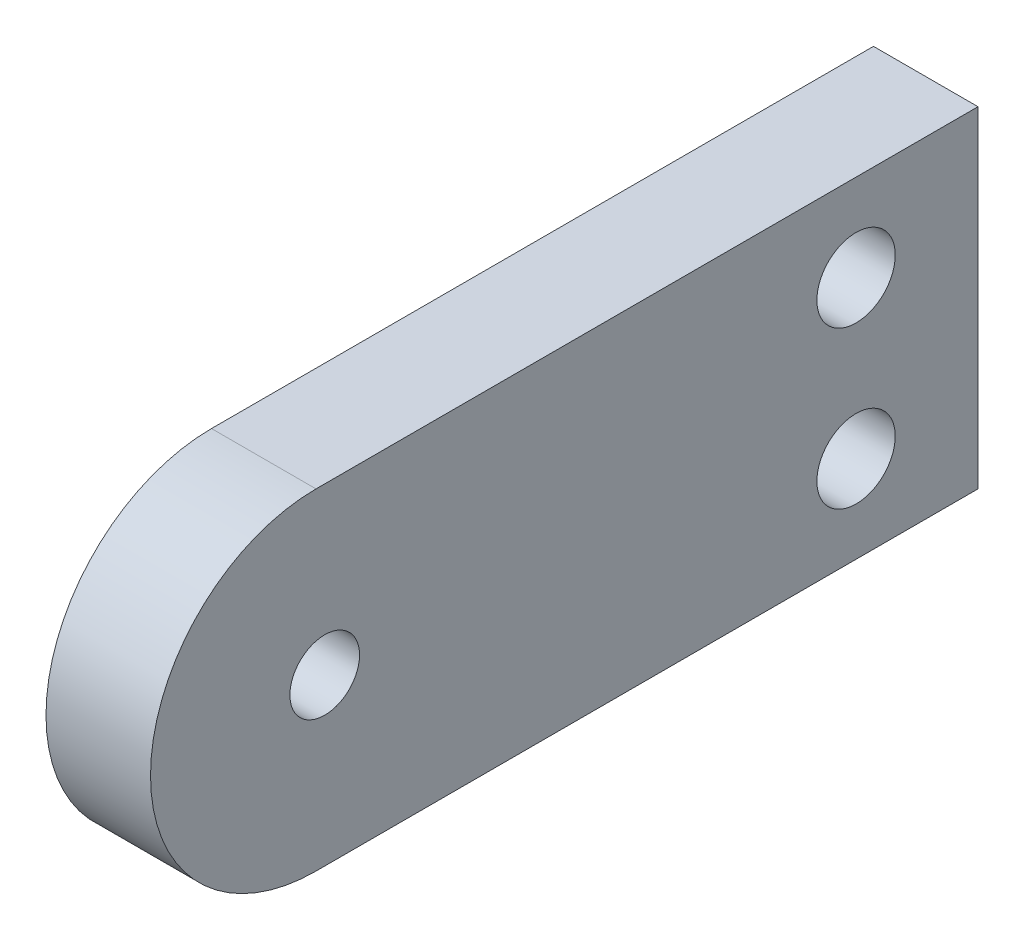
ISO-10303-21;
HEADER;
FILE_DESCRIPTION(('STEP AP214'),'2;1');
FILE_NAME('part.step','',(''),(''),'','','');
FILE_SCHEMA(('AUTOMOTIVE_DESIGN { 1 0 10303 214 1 1 1 1 }'));
ENDSEC;
DATA;
#1=APPLICATION_CONTEXT('core data for automotive mechanical design processes');
#2=APPLICATION_PROTOCOL_DEFINITION('international standard','automotive_design',2000,#1);
#3=PRODUCT_CONTEXT('',#1,'mechanical');
#4=PRODUCT('Part','Part','',(#3));
#5=PRODUCT_RELATED_PRODUCT_CATEGORY('part','',(#4));
#6=PRODUCT_DEFINITION_FORMATION('','',#4);
#7=PRODUCT_DEFINITION_CONTEXT('part definition',#1,'design');
#8=PRODUCT_DEFINITION('design','',#6,#7);
#9=PRODUCT_DEFINITION_SHAPE('','',#8);
#10=(LENGTH_UNIT() NAMED_UNIT(*) SI_UNIT(.MILLI.,.METRE.));
#11=(NAMED_UNIT(*) PLANE_ANGLE_UNIT() SI_UNIT($,.RADIAN.));
#12=(NAMED_UNIT(*) SI_UNIT($,.STERADIAN.) SOLID_ANGLE_UNIT());
#13=UNCERTAINTY_MEASURE_WITH_UNIT(LENGTH_MEASURE(1.E-05),#10,'distance_accuracy_value','');
#14=(GEOMETRIC_REPRESENTATION_CONTEXT(3) GLOBAL_UNCERTAINTY_ASSIGNED_CONTEXT((#13)) GLOBAL_UNIT_ASSIGNED_CONTEXT((#10,
#11,#12)) REPRESENTATION_CONTEXT('',''));
#15=CARTESIAN_POINT('',(0.,0.,0.));
#16=DIRECTION('',(0.,0.,1.));
#17=DIRECTION('',(1.,0.,0.));
#18=AXIS2_PLACEMENT_3D('',#15,#16,#17);
#19=CARTESIAN_POINT('',(22.,-4.5,119.5));
#20=DIRECTION('',(1.,0.,0.));
#21=DIRECTION('',(0.,0.,-1.));
#22=AXIS2_PLACEMENT_3D('',#19,#20,#21);
#23=CYLINDRICAL_SURFACE('',#22,1.5);
#24=CARTESIAN_POINT('',(22.,-4.5,119.5));
#25=DIRECTION('',(1.,0.,0.));
#26=DIRECTION('',(0.,0.,-1.));
#27=AXIS2_PLACEMENT_3D('',#24,#25,#26);
#28=CIRCLE('',#27,1.5);
#29=CARTESIAN_POINT('',(22.,-4.5,118.));
#30=VERTEX_POINT('',#29);
#31=EDGE_CURVE('E322',#30,#30,#28,.T.);
#32=ORIENTED_EDGE('',*,*,#31,.F.);
#33=EDGE_LOOP('',(#32));
#34=FACE_BOUND('',#33,.T.);
#35=CARTESIAN_POINT('',(24.,-4.5,119.5));
#36=DIRECTION('',(1.,0.,0.));
#37=DIRECTION('',(0.,1.,0.));
#38=AXIS2_PLACEMENT_3D('',#35,#36,#37);
#39=CIRCLE('',#38,1.5);
#40=CARTESIAN_POINT('',(24.,-3.,119.5));
#41=VERTEX_POINT('',#40);
#42=EDGE_CURVE('E239',#41,#41,#39,.F.);
#43=ORIENTED_EDGE('',*,*,#42,.F.);
#44=EDGE_LOOP('',(#43));
#45=FACE_BOUND('',#44,.T.);
#46=ADVANCED_FACE('F235',(#34,#45),#23,.F.);
#47=CARTESIAN_POINT('',(22.,4.5,119.5));
#48=DIRECTION('',(1.,0.,0.));
#49=DIRECTION('',(0.,0.,-1.));
#50=AXIS2_PLACEMENT_3D('',#47,#48,#49);
#51=CYLINDRICAL_SURFACE('',#50,1.5);
#52=CARTESIAN_POINT('',(22.,4.5,119.5));
#53=DIRECTION('',(1.,0.,0.));
#54=DIRECTION('',(0.,0.,-1.));
#55=AXIS2_PLACEMENT_3D('',#52,#53,#54);
#56=CIRCLE('',#55,1.5);
#57=CARTESIAN_POINT('',(22.,4.5,118.));
#58=VERTEX_POINT('',#57);
#59=EDGE_CURVE('E290',#58,#58,#56,.T.);
#60=ORIENTED_EDGE('',*,*,#59,.F.);
#61=EDGE_LOOP('',(#60));
#62=FACE_BOUND('',#61,.T.);
#63=CARTESIAN_POINT('',(24.,4.5,119.5));
#64=DIRECTION('',(1.,0.,0.));
#65=DIRECTION('',(0.,1.,0.));
#66=AXIS2_PLACEMENT_3D('',#63,#64,#65);
#67=CIRCLE('',#66,1.5);
#68=CARTESIAN_POINT('',(24.,6.,119.5));
#69=VERTEX_POINT('',#68);
#70=EDGE_CURVE('E316',#69,#69,#67,.F.);
#71=ORIENTED_EDGE('',*,*,#70,.F.);
#72=EDGE_LOOP('',(#71));
#73=FACE_BOUND('',#72,.T.);
#74=ADVANCED_FACE('F346',(#62,#73),#51,.F.);
#75=CARTESIAN_POINT('',(28.,0.,0.));
#76=DIRECTION('',(1.,0.,0.));
#77=DIRECTION('',(0.,0.,-1.));
#78=AXIS2_PLACEMENT_3D('',#75,#76,#77);
#79=PLANE('',#78);
#80=CARTESIAN_POINT('',(28.,4.5,119.5));
#81=DIRECTION('',(1.,0.,0.));
#82=DIRECTION('',(0.,0.,-1.));
#83=AXIS2_PLACEMENT_3D('',#80,#81,#82);
#84=CIRCLE('',#83,2.25);
#85=CARTESIAN_POINT('',(28.,4.5,117.25));
#86=VERTEX_POINT('',#85);
#87=EDGE_CURVE('E324',#86,#86,#84,.T.);
#88=ORIENTED_EDGE('',*,*,#87,.F.);
#89=EDGE_LOOP('',(#88));
#90=FACE_BOUND('',#89,.T.);
#91=CARTESIAN_POINT('',(28.,-4.5,119.5));
#92=DIRECTION('',(1.,0.,0.));
#93=DIRECTION('',(0.,0.,-1.));
#94=AXIS2_PLACEMENT_3D('',#91,#92,#93);
#95=CIRCLE('',#94,2.25);
#96=CARTESIAN_POINT('',(28.,-4.5,117.25));
#97=VERTEX_POINT('',#96);
#98=EDGE_CURVE('E329',#97,#97,#95,.T.);
#99=ORIENTED_EDGE('',*,*,#98,.F.);
#100=EDGE_LOOP('',(#99));
#101=FACE_BOUND('',#100,.T.);
#102=DIRECTION('',(0.,-1.,0.));
#103=VECTOR('',#102,1.);
#104=CARTESIAN_POINT('',(28.,9.5,112.5));
#105=LINE('',#104,#103);
#106=CARTESIAN_POINT('',(28.,9.5,112.5));
#107=VERTEX_POINT('',#106);
#108=CARTESIAN_POINT('',(28.,-9.5,112.5));
#109=VERTEX_POINT('',#108);
#110=EDGE_CURVE('E289',#107,#109,#105,.T.);
#111=ORIENTED_EDGE('',*,*,#110,.F.);
#112=DIRECTION('',(0.,0.,-1.));
#113=VECTOR('',#112,1.);
#114=CARTESIAN_POINT('',(28.,9.5,160.));
#115=LINE('',#114,#113);
#116=CARTESIAN_POINT('',(28.,9.5,150.5));
#117=VERTEX_POINT('',#116);
#118=EDGE_CURVE('E306',#117,#107,#115,.T.);
#119=ORIENTED_EDGE('',*,*,#118,.F.);
#120=CARTESIAN_POINT('',(28.,0.,150.5));
#121=DIRECTION('',(1.,0.,0.));
#122=DIRECTION('',(0.,0.,-1.));
#123=AXIS2_PLACEMENT_3D('',#120,#121,#122);
#124=CIRCLE('',#123,9.5);
#125=CARTESIAN_POINT('',(28.,-9.5,150.5));
#126=VERTEX_POINT('',#125);
#127=EDGE_CURVE('E244',#117,#126,#124,.T.);
#128=ORIENTED_EDGE('',*,*,#127,.T.);
#129=DIRECTION('',(0.,0.,-1.));
#130=VECTOR('',#129,1.);
#131=CARTESIAN_POINT('',(28.,-9.5,160.));
#132=LINE('',#131,#130);
#133=EDGE_CURVE('E283',#126,#109,#132,.T.);
#134=ORIENTED_EDGE('',*,*,#133,.T.);
#135=EDGE_LOOP('',(#111,#119,#128,#134));
#136=FACE_BOUND('',#135,.T.);
#137=CARTESIAN_POINT('',(28.,0.,150.));
#138=DIRECTION('',(1.,0.,0.));
#139=DIRECTION('',(0.,0.,-1.));
#140=AXIS2_PLACEMENT_3D('',#137,#138,#139);
#141=CIRCLE('',#140,2.);
#142=CARTESIAN_POINT('',(28.,0.,148.));
#143=VERTEX_POINT('',#142);
#144=EDGE_CURVE('E297',#143,#143,#141,.T.);
#145=ORIENTED_EDGE('',*,*,#144,.F.);
#146=EDGE_LOOP('',(#145));
#147=FACE_BOUND('',#146,.T.);
#148=ADVANCED_FACE('F367',(#90,#101,#136,#147),#79,.T.);
#149=CARTESIAN_POINT('',(28.,9.5,160.));
#150=DIRECTION('',(0.,-1.,0.));
#151=DIRECTION('',(0.,0.,-1.));
#152=AXIS2_PLACEMENT_3D('',#149,#150,#151);
#153=PLANE('',#152);
#154=DIRECTION('',(1.,0.,0.));
#155=VECTOR('',#154,1.);
#156=CARTESIAN_POINT('',(0.,9.5,112.5));
#157=LINE('',#156,#155);
#158=CARTESIAN_POINT('',(22.,9.5,112.5));
#159=VERTEX_POINT('',#158);
#160=EDGE_CURVE('E295',#159,#107,#157,.T.);
#161=ORIENTED_EDGE('',*,*,#160,.F.);
#162=DIRECTION('',(0.,0.,-1.));
#163=VECTOR('',#162,1.);
#164=CARTESIAN_POINT('',(22.,9.5,160.));
#165=LINE('',#164,#163);
#166=CARTESIAN_POINT('',(22.,9.5,150.5));
#167=VERTEX_POINT('',#166);
#168=EDGE_CURVE('E252',#167,#159,#165,.T.);
#169=ORIENTED_EDGE('',*,*,#168,.F.);
#170=DIRECTION('',(-1.,0.,0.));
#171=VECTOR('',#170,1.);
#172=CARTESIAN_POINT('',(28.,9.5,150.5));
#173=LINE('',#172,#171);
#174=EDGE_CURVE('E313',#167,#117,#173,.F.);
#175=ORIENTED_EDGE('',*,*,#174,.T.);
#176=ORIENTED_EDGE('',*,*,#118,.T.);
#177=EDGE_LOOP('',(#161,#169,#175,#176));
#178=FACE_BOUND('',#177,.T.);
#179=ADVANCED_FACE('F376',(#178),#153,.F.);
#180=CARTESIAN_POINT('',(22.,9.5,160.));
#181=DIRECTION('',(1.,0.,0.));
#182=DIRECTION('',(0.,1.,0.));
#183=AXIS2_PLACEMENT_3D('',#180,#181,#182);
#184=PLANE('',#183);
#185=ORIENTED_EDGE('',*,*,#59,.T.);
#186=EDGE_LOOP('',(#185));
#187=FACE_BOUND('',#186,.T.);
#188=ORIENTED_EDGE('',*,*,#31,.T.);
#189=EDGE_LOOP('',(#188));
#190=FACE_BOUND('',#189,.T.);
#191=CARTESIAN_POINT('',(22.,0.,150.));
#192=DIRECTION('',(1.,0.,0.));
#193=DIRECTION('',(0.,1.,0.));
#194=AXIS2_PLACEMENT_3D('',#191,#192,#193);
#195=CIRCLE('',#194,2.);
#196=CARTESIAN_POINT('',(22.,2.,150.));
#197=VERTEX_POINT('',#196);
#198=EDGE_CURVE('E303',#197,#197,#195,.F.);
#199=ORIENTED_EDGE('',*,*,#198,.F.);
#200=EDGE_LOOP('',(#199));
#201=FACE_BOUND('',#200,.T.);
#202=CARTESIAN_POINT('',(22.,0.,150.5));
#203=DIRECTION('',(1.,0.,0.));
#204=DIRECTION('',(0.,1.,0.));
#205=AXIS2_PLACEMENT_3D('',#202,#203,#204);
#206=CIRCLE('',#205,9.5);
#207=CARTESIAN_POINT('',(22.,-9.5,150.5));
#208=VERTEX_POINT('',#207);
#209=EDGE_CURVE('E309',#208,#167,#206,.F.);
#210=ORIENTED_EDGE('',*,*,#209,.T.);
#211=ORIENTED_EDGE('',*,*,#168,.T.);
#212=DIRECTION('',(0.,-1.,0.));
#213=VECTOR('',#212,1.);
#214=CARTESIAN_POINT('',(22.,9.5,112.5));
#215=LINE('',#214,#213);
#216=CARTESIAN_POINT('',(22.,-9.5,112.5));
#217=VERTEX_POINT('',#216);
#218=EDGE_CURVE('E285',#159,#217,#215,.T.);
#219=ORIENTED_EDGE('',*,*,#218,.T.);
#220=DIRECTION('',(0.,0.,-1.));
#221=VECTOR('',#220,1.);
#222=CARTESIAN_POINT('',(22.,-9.5,160.));
#223=LINE('',#222,#221);
#224=EDGE_CURVE('E277',#208,#217,#223,.T.);
#225=ORIENTED_EDGE('',*,*,#224,.F.);
#226=EDGE_LOOP('',(#210,#211,#219,#225));
#227=FACE_BOUND('',#226,.T.);
#228=ADVANCED_FACE('F286',(#187,#190,#201,#227),#184,.F.);
#229=CARTESIAN_POINT('',(28.,-9.5,160.));
#230=DIRECTION('',(0.,-1.,0.));
#231=DIRECTION('',(0.,0.,-1.));
#232=AXIS2_PLACEMENT_3D('',#229,#230,#231);
#233=PLANE('',#232);
#234=ORIENTED_EDGE('',*,*,#224,.T.);
#235=DIRECTION('',(1.,0.,0.));
#236=VECTOR('',#235,1.);
#237=CARTESIAN_POINT('',(0.,-9.5,112.5));
#238=LINE('',#237,#236);
#239=EDGE_CURVE('E280',#217,#109,#238,.T.);
#240=ORIENTED_EDGE('',*,*,#239,.T.);
#241=ORIENTED_EDGE('',*,*,#133,.F.);
#242=DIRECTION('',(-1.,0.,0.));
#243=VECTOR('',#242,1.);
#244=CARTESIAN_POINT('',(22.,-9.5,150.5));
#245=LINE('',#244,#243);
#246=EDGE_CURVE('E14',#126,#208,#245,.T.);
#247=ORIENTED_EDGE('',*,*,#246,.T.);
#248=EDGE_LOOP('',(#234,#240,#241,#247));
#249=FACE_BOUND('',#248,.T.);
#250=ADVANCED_FACE('F278',(#249),#233,.T.);
#251=CARTESIAN_POINT('',(28.,0.,150.));
#252=DIRECTION('',(-1.,0.,0.));
#253=DIRECTION('',(0.,0.,1.));
#254=AXIS2_PLACEMENT_3D('',#251,#252,#253);
#255=CYLINDRICAL_SURFACE('',#254,2.);
#256=ORIENTED_EDGE('',*,*,#144,.T.);
#257=EDGE_LOOP('',(#256));
#258=FACE_BOUND('',#257,.T.);
#259=ORIENTED_EDGE('',*,*,#198,.T.);
#260=EDGE_LOOP('',(#259));
#261=FACE_BOUND('',#260,.T.);
#262=ADVANCED_FACE('F372',(#258,#261),#255,.F.);
#263=CARTESIAN_POINT('',(28.,0.,150.5));
#264=DIRECTION('',(1.,0.,0.));
#265=DIRECTION('',(0.,0.,-1.));
#266=AXIS2_PLACEMENT_3D('',#263,#264,#265);
#267=CYLINDRICAL_SURFACE('',#266,9.5);
#268=ORIENTED_EDGE('',*,*,#246,.F.);
#269=ORIENTED_EDGE('',*,*,#127,.F.);
#270=ORIENTED_EDGE('',*,*,#174,.F.);
#271=ORIENTED_EDGE('',*,*,#209,.F.);
#272=EDGE_LOOP('',(#268,#269,#270,#271));
#273=FACE_BOUND('',#272,.T.);
#274=ADVANCED_FACE('F237',(#273),#267,.T.);
#275=CARTESIAN_POINT('',(0.,9.5,112.5));
#276=DIRECTION('',(0.,0.,1.));
#277=DIRECTION('',(1.,0.,0.));
#278=AXIS2_PLACEMENT_3D('',#275,#276,#277);
#279=PLANE('',#278);
#280=ORIENTED_EDGE('',*,*,#239,.F.);
#281=ORIENTED_EDGE('',*,*,#218,.F.);
#282=ORIENTED_EDGE('',*,*,#160,.T.);
#283=ORIENTED_EDGE('',*,*,#110,.T.);
#284=EDGE_LOOP('',(#280,#281,#282,#283));
#285=FACE_BOUND('',#284,.T.);
#286=ADVANCED_FACE('F293',(#285),#279,.F.);
#287=CARTESIAN_POINT('',(24.,9.5,160.));
#288=DIRECTION('',(1.,0.,0.));
#289=DIRECTION('',(0.,1.,0.));
#290=AXIS2_PLACEMENT_3D('',#287,#288,#289);
#291=PLANE('',#290);
#292=CARTESIAN_POINT('',(24.,4.5,119.5));
#293=DIRECTION('',(1.,0.,0.));
#294=DIRECTION('',(0.,1.,0.));
#295=AXIS2_PLACEMENT_3D('',#292,#293,#294);
#296=CIRCLE('',#295,2.25);
#297=CARTESIAN_POINT('',(24.,6.75,119.5));
#298=VERTEX_POINT('',#297);
#299=EDGE_CURVE('E318',#298,#298,#296,.F.);
#300=ORIENTED_EDGE('',*,*,#299,.F.);
#301=EDGE_LOOP('',(#300));
#302=FACE_BOUND('',#301,.T.);
#303=ORIENTED_EDGE('',*,*,#70,.T.);
#304=EDGE_LOOP('',(#303));
#305=FACE_BOUND('',#304,.T.);
#306=ADVANCED_FACE('F362',(#302,#305),#291,.T.);
#307=CARTESIAN_POINT('',(15.6360389693211,4.5,119.5));
#308=DIRECTION('',(1.,0.,0.));
#309=DIRECTION('',(0.,0.,-1.));
#310=AXIS2_PLACEMENT_3D('',#307,#308,#309);
#311=CYLINDRICAL_SURFACE('',#310,2.25);
#312=ORIENTED_EDGE('',*,*,#299,.T.);
#313=EDGE_LOOP('',(#312));
#314=FACE_BOUND('',#313,.T.);
#315=ORIENTED_EDGE('',*,*,#87,.T.);
#316=EDGE_LOOP('',(#315));
#317=FACE_BOUND('',#316,.T.);
#318=ADVANCED_FACE('F353',(#314,#317),#311,.F.);
#319=CARTESIAN_POINT('',(24.,9.5,160.));
#320=DIRECTION('',(1.,0.,0.));
#321=DIRECTION('',(0.,1.,0.));
#322=AXIS2_PLACEMENT_3D('',#319,#320,#321);
#323=PLANE('',#322);
#324=CARTESIAN_POINT('',(24.,-4.5,119.5));
#325=DIRECTION('',(1.,0.,0.));
#326=DIRECTION('',(0.,1.,0.));
#327=AXIS2_PLACEMENT_3D('',#324,#325,#326);
#328=CIRCLE('',#327,2.25);
#329=CARTESIAN_POINT('',(24.,-2.25000000000001,119.5));
#330=VERTEX_POINT('',#329);
#331=EDGE_CURVE('E332',#330,#330,#328,.F.);
#332=ORIENTED_EDGE('',*,*,#331,.F.);
#333=EDGE_LOOP('',(#332));
#334=FACE_BOUND('',#333,.T.);
#335=ORIENTED_EDGE('',*,*,#42,.T.);
#336=EDGE_LOOP('',(#335));
#337=FACE_BOUND('',#336,.T.);
#338=ADVANCED_FACE('F350',(#334,#337),#323,.T.);
#339=CARTESIAN_POINT('',(15.6360389693211,-4.5,119.5));
#340=DIRECTION('',(1.,0.,0.));
#341=DIRECTION('',(0.,0.,-1.));
#342=AXIS2_PLACEMENT_3D('',#339,#340,#341);
#343=CYLINDRICAL_SURFACE('',#342,2.25);
#344=ORIENTED_EDGE('',*,*,#331,.T.);
#345=EDGE_LOOP('',(#344));
#346=FACE_BOUND('',#345,.T.);
#347=ORIENTED_EDGE('',*,*,#98,.T.);
#348=EDGE_LOOP('',(#347));
#349=FACE_BOUND('',#348,.T.);
#350=ADVANCED_FACE('F352',(#346,#349),#343,.F.);
#351=CLOSED_SHELL('',(#46,#74,#148,#179,#228,#250,#262,#274,#286,#306,#318,#338,#350));
#352=MANIFOLD_SOLID_BREP('B2',#351);
#353=ADVANCED_BREP_SHAPE_REPRESENTATION('',(#18,#352),#14);
#354=SHAPE_DEFINITION_REPRESENTATION(#9,#353);
ENDSEC;
END-ISO-10303-21;
